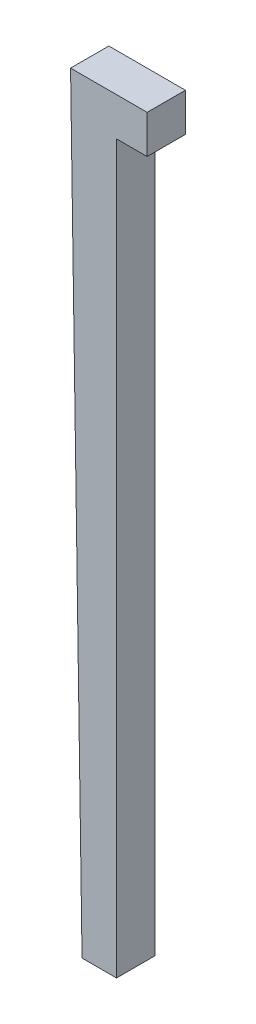
ISO-10303-21;
HEADER;
FILE_DESCRIPTION(('STEP AP214'),'2;1');
FILE_NAME('part.step','',(''),(''),'','','');
FILE_SCHEMA(('AUTOMOTIVE_DESIGN { 1 0 10303 214 1 1 1 1 }'));
ENDSEC;
DATA;
#1=APPLICATION_CONTEXT('core data for automotive mechanical design processes');
#2=APPLICATION_PROTOCOL_DEFINITION('international standard','automotive_design',2000,#1);
#3=PRODUCT_CONTEXT('',#1,'mechanical');
#4=PRODUCT('Part','Part','',(#3));
#5=PRODUCT_RELATED_PRODUCT_CATEGORY('part','',(#4));
#6=PRODUCT_DEFINITION_FORMATION('','',#4);
#7=PRODUCT_DEFINITION_CONTEXT('part definition',#1,'design');
#8=PRODUCT_DEFINITION('design','',#6,#7);
#9=PRODUCT_DEFINITION_SHAPE('','',#8);
#10=(LENGTH_UNIT() NAMED_UNIT(*) SI_UNIT(.MILLI.,.METRE.));
#11=(NAMED_UNIT(*) PLANE_ANGLE_UNIT() SI_UNIT($,.RADIAN.));
#12=(NAMED_UNIT(*) SI_UNIT($,.STERADIAN.) SOLID_ANGLE_UNIT());
#13=UNCERTAINTY_MEASURE_WITH_UNIT(LENGTH_MEASURE(1.E-05),#10,'distance_accuracy_value','');
#14=(GEOMETRIC_REPRESENTATION_CONTEXT(3) GLOBAL_UNCERTAINTY_ASSIGNED_CONTEXT((#13)) GLOBAL_UNIT_ASSIGNED_CONTEXT((#10,
#11,#12)) REPRESENTATION_CONTEXT('',''));
#15=CARTESIAN_POINT('',(0.,0.,0.));
#16=DIRECTION('',(0.,0.,1.));
#17=DIRECTION('',(1.,0.,0.));
#18=AXIS2_PLACEMENT_3D('',#15,#16,#17);
#19=CARTESIAN_POINT('',(9.50876330615437,0.,-2.5));
#20=DIRECTION('',(1.,0.,0.));
#21=DIRECTION('',(0.,0.,1.));
#22=AXIS2_PLACEMENT_3D('',#19,#20,#21);
#23=PLANE('',#22);
#24=CARTESIAN_POINT('',(9.50876330615437,0.,-2.5));
#25=CARTESIAN_POINT('',(9.50876330615436,-33.3,-2.5));
#26=CARTESIAN_POINT('',(9.50876330615435,-66.6,-2.5));
#27=CARTESIAN_POINT('',(9.50876330615434,-99.9,-2.5));
#28=B_SPLINE_CURVE_WITH_KNOTS('',3,(#24,#25,#26,#27),.UNSPECIFIED.,.F.,.F.,(4,4),(0.,1.),.UNSPECIFIED.);
#29=CARTESIAN_POINT('',(9.50876330615434,-5.,-2.5));
#30=VERTEX_POINT('',#29);
#31=CARTESIAN_POINT('',(9.50876330615434,-99.9,-2.5));
#32=VERTEX_POINT('',#31);
#33=EDGE_CURVE('E121',#30,#32,#28,.T.);
#34=ORIENTED_EDGE('',*,*,#33,.F.);
#35=DIRECTION('',(0.,0.,1.));
#36=VECTOR('',#35,1.);
#37=CARTESIAN_POINT('',(9.50876330615434,-5.,-2.5));
#38=LINE('',#37,#36);
#39=CARTESIAN_POINT('',(9.50876330615437,-5.,2.5));
#40=VERTEX_POINT('',#39);
#41=EDGE_CURVE('E282',#30,#40,#38,.T.);
#42=ORIENTED_EDGE('',*,*,#41,.T.);
#43=CARTESIAN_POINT('',(9.50876330615437,0.,2.5));
#44=CARTESIAN_POINT('',(9.50876330615436,-33.3,2.5));
#45=CARTESIAN_POINT('',(9.50876330615435,-66.6,2.5));
#46=CARTESIAN_POINT('',(9.50876330615434,-99.9,2.5));
#47=B_SPLINE_CURVE_WITH_KNOTS('',3,(#43,#44,#45,#46),.UNSPECIFIED.,.F.,.F.,(4,4),(0.,1.),.UNSPECIFIED.);
#48=CARTESIAN_POINT('',(9.50876330615434,-99.9,2.5));
#49=VERTEX_POINT('',#48);
#50=EDGE_CURVE('E267',#40,#49,#47,.T.);
#51=ORIENTED_EDGE('',*,*,#50,.T.);
#52=DIRECTION('',(0.,0.,-1.));
#53=VECTOR('',#52,1.);
#54=CARTESIAN_POINT('',(9.50876330615434,-99.9,2.5));
#55=LINE('',#54,#53);
#56=EDGE_CURVE('E263',#49,#32,#55,.T.);
#57=ORIENTED_EDGE('',*,*,#56,.T.);
#58=EDGE_LOOP('',(#34,#42,#51,#57));
#59=FACE_BOUND('',#58,.T.);
#60=ADVANCED_FACE('F95',(#59),#23,.T.);
#61=CARTESIAN_POINT('',(0.,-99.9,0.));
#62=DIRECTION('',(0.,1.,0.));
#63=DIRECTION('',(0.,0.,1.));
#64=AXIS2_PLACEMENT_3D('',#61,#62,#63);
#65=PLANE('',#64);
#66=ORIENTED_EDGE('',*,*,#56,.F.);
#67=DIRECTION('',(1.,0.,0.));
#68=VECTOR('',#67,1.);
#69=CARTESIAN_POINT('',(9.50876330615434,-99.9,2.5));
#70=LINE('',#69,#68);
#71=CARTESIAN_POINT('',(5.00876330615434,-99.9,2.5));
#72=VERTEX_POINT('',#71);
#73=EDGE_CURVE('E13',#72,#49,#70,.T.);
#74=ORIENTED_EDGE('',*,*,#73,.F.);
#75=DIRECTION('',(0.,0.,1.));
#76=VECTOR('',#75,1.);
#77=CARTESIAN_POINT('',(5.00876330615434,-99.9,2.5));
#78=LINE('',#77,#76);
#79=CARTESIAN_POINT('',(5.00876330615434,-99.9,-2.5));
#80=VERTEX_POINT('',#79);
#81=EDGE_CURVE('E105',#80,#72,#78,.T.);
#82=ORIENTED_EDGE('',*,*,#81,.F.);
#83=DIRECTION('',(-1.,0.,0.));
#84=VECTOR('',#83,1.);
#85=CARTESIAN_POINT('',(9.50876330615434,-99.9,-2.5));
#86=LINE('',#85,#84);
#87=EDGE_CURVE('E369',#32,#80,#86,.T.);
#88=ORIENTED_EDGE('',*,*,#87,.F.);
#89=EDGE_LOOP('',(#66,#74,#82,#88));
#90=FACE_BOUND('',#89,.T.);
#91=ADVANCED_FACE('F199',(#90),#65,.F.);
#92=CARTESIAN_POINT('',(0.,0.,0.));
#93=DIRECTION('',(0.,1.,0.));
#94=DIRECTION('',(0.,0.,1.));
#95=AXIS2_PLACEMENT_3D('',#92,#93,#94);
#96=PLANE('',#95);
#97=DIRECTION('',(0.,0.,1.));
#98=VECTOR('',#97,1.);
#99=CARTESIAN_POINT('',(3.50876330615437,0.,2.5));
#100=LINE('',#99,#98);
#101=CARTESIAN_POINT('',(3.50876330615437,0.,-2.5));
#102=VERTEX_POINT('',#101);
#103=CARTESIAN_POINT('',(3.50876330615437,0.,2.5));
#104=VERTEX_POINT('',#103);
#105=EDGE_CURVE('E177',#102,#104,#100,.T.);
#106=ORIENTED_EDGE('',*,*,#105,.T.);
#107=DIRECTION('',(1.,0.,0.));
#108=VECTOR('',#107,1.);
#109=CARTESIAN_POINT('',(9.50876330615437,0.,2.5));
#110=LINE('',#109,#108);
#111=CARTESIAN_POINT('',(9.50876330615434,0.,2.5));
#112=VERTEX_POINT('',#111);
#113=EDGE_CURVE('E99',#104,#112,#110,.T.);
#114=ORIENTED_EDGE('',*,*,#113,.T.);
#115=DIRECTION('',(-1.,0.,0.));
#116=VECTOR('',#115,1.);
#117=CARTESIAN_POINT('',(9.50876330615434,0.,2.5));
#118=LINE('',#117,#116);
#119=CARTESIAN_POINT('',(13.5087633061544,0.,2.5));
#120=VERTEX_POINT('',#119);
#121=EDGE_CURVE('E387',#120,#112,#118,.T.);
#122=ORIENTED_EDGE('',*,*,#121,.F.);
#123=DIRECTION('',(0.,0.,1.));
#124=VECTOR('',#123,1.);
#125=CARTESIAN_POINT('',(13.5087633061544,0.,-2.5));
#126=LINE('',#125,#124);
#127=CARTESIAN_POINT('',(13.5087633061544,0.,-2.5));
#128=VERTEX_POINT('',#127);
#129=EDGE_CURVE('E166',#128,#120,#126,.T.);
#130=ORIENTED_EDGE('',*,*,#129,.F.);
#131=DIRECTION('',(-1.,0.,0.));
#132=VECTOR('',#131,1.);
#133=CARTESIAN_POINT('',(9.50876330615434,0.,-2.5));
#134=LINE('',#133,#132);
#135=CARTESIAN_POINT('',(9.50876330615434,0.,-2.5));
#136=VERTEX_POINT('',#135);
#137=EDGE_CURVE('E158',#128,#136,#134,.T.);
#138=ORIENTED_EDGE('',*,*,#137,.T.);
#139=DIRECTION('',(-1.,0.,0.));
#140=VECTOR('',#139,1.);
#141=CARTESIAN_POINT('',(9.50876330615437,0.,-2.5));
#142=LINE('',#141,#140);
#143=EDGE_CURVE('E162',#136,#102,#142,.T.);
#144=ORIENTED_EDGE('',*,*,#143,.T.);
#145=EDGE_LOOP('',(#106,#114,#122,#130,#138,#144));
#146=FACE_BOUND('',#145,.T.);
#147=ADVANCED_FACE('F161',(#146),#96,.T.);
#148=CARTESIAN_POINT('',(3.50876330615437,0.,-2.5));
#149=DIRECTION('',(0.,0.,-1.));
#150=DIRECTION('',(1.,0.,0.));
#151=AXIS2_PLACEMENT_3D('',#148,#149,#150);
#152=PLANE('',#151);
#153=ORIENTED_EDGE('',*,*,#143,.F.);
#154=ORIENTED_EDGE('',*,*,#137,.F.);
#155=DIRECTION('',(0.,1.,0.));
#156=VECTOR('',#155,1.);
#157=CARTESIAN_POINT('',(13.5087633061544,0.,-2.5));
#158=LINE('',#157,#156);
#159=CARTESIAN_POINT('',(13.5087633061544,-5.,-2.5));
#160=VERTEX_POINT('',#159);
#161=EDGE_CURVE('E384',#160,#128,#158,.T.);
#162=ORIENTED_EDGE('',*,*,#161,.F.);
#163=DIRECTION('',(1.,0.,0.));
#164=VECTOR('',#163,1.);
#165=CARTESIAN_POINT('',(9.50876330615434,-5.,-2.5));
#166=LINE('',#165,#164);
#167=EDGE_CURVE('E169',#30,#160,#166,.T.);
#168=ORIENTED_EDGE('',*,*,#167,.F.);
#169=ORIENTED_EDGE('',*,*,#33,.T.);
#170=ORIENTED_EDGE('',*,*,#87,.T.);
#171=CARTESIAN_POINT('',(3.50876330615437,0.,-2.5));
#172=CARTESIAN_POINT('',(4.00876330615436,-33.3,-2.5));
#173=CARTESIAN_POINT('',(4.50876330615435,-66.6,-2.5));
#174=CARTESIAN_POINT('',(5.00876330615434,-99.9,-2.5));
#175=B_SPLINE_CURVE_WITH_KNOTS('',3,(#171,#172,#173,#174),.UNSPECIFIED.,.F.,.F.,(4,4),(0.,1.),.UNSPECIFIED.);
#176=EDGE_CURVE('E176',#102,#80,#175,.T.);
#177=ORIENTED_EDGE('',*,*,#176,.F.);
#178=EDGE_LOOP('',(#153,#154,#162,#168,#169,#170,#177));
#179=FACE_BOUND('',#178,.T.);
#180=ADVANCED_FACE('F174',(#179),#152,.T.);
#181=CARTESIAN_POINT('',(3.50876330615437,0.,2.5));
#182=DIRECTION('',(-0.999887293718972,-0.0150133227285128,0.));
#183=DIRECTION('',(0.,0.,-1.));
#184=AXIS2_PLACEMENT_3D('',#181,#182,#183);
#185=PLANE('',#184);
#186=ORIENTED_EDGE('',*,*,#105,.F.);
#187=ORIENTED_EDGE('',*,*,#176,.T.);
#188=ORIENTED_EDGE('',*,*,#81,.T.);
#189=CARTESIAN_POINT('',(3.50876330615437,0.,2.5));
#190=CARTESIAN_POINT('',(4.00876330615436,-33.3,2.5));
#191=CARTESIAN_POINT('',(4.50876330615435,-66.6,2.5));
#192=CARTESIAN_POINT('',(5.00876330615434,-99.9,2.5));
#193=B_SPLINE_CURVE_WITH_KNOTS('',3,(#189,#190,#191,#192),.UNSPECIFIED.,.F.,.F.,(4,4),(0.,1.),.UNSPECIFIED.);
#194=EDGE_CURVE('E275',#104,#72,#193,.T.);
#195=ORIENTED_EDGE('',*,*,#194,.F.);
#196=EDGE_LOOP('',(#186,#187,#188,#195));
#197=FACE_BOUND('',#196,.T.);
#198=ADVANCED_FACE('F198',(#197),#185,.T.);
#199=CARTESIAN_POINT('',(9.50876330615437,0.,2.5));
#200=DIRECTION('',(0.,0.,1.));
#201=DIRECTION('',(-1.,0.,0.));
#202=AXIS2_PLACEMENT_3D('',#199,#200,#201);
#203=PLANE('',#202);
#204=ORIENTED_EDGE('',*,*,#113,.F.);
#205=ORIENTED_EDGE('',*,*,#194,.T.);
#206=ORIENTED_EDGE('',*,*,#73,.T.);
#207=ORIENTED_EDGE('',*,*,#50,.F.);
#208=DIRECTION('',(1.,0.,0.));
#209=VECTOR('',#208,1.);
#210=CARTESIAN_POINT('',(9.50876330615434,-5.,2.5));
#211=LINE('',#210,#209);
#212=CARTESIAN_POINT('',(13.5087633061544,-5.,2.5));
#213=VERTEX_POINT('',#212);
#214=EDGE_CURVE('E113',#40,#213,#211,.T.);
#215=ORIENTED_EDGE('',*,*,#214,.T.);
#216=DIRECTION('',(0.,1.,0.));
#217=VECTOR('',#216,1.);
#218=CARTESIAN_POINT('',(13.5087633061544,0.,2.5));
#219=LINE('',#218,#217);
#220=EDGE_CURVE('E170',#213,#120,#219,.T.);
#221=ORIENTED_EDGE('',*,*,#220,.T.);
#222=ORIENTED_EDGE('',*,*,#121,.T.);
#223=EDGE_LOOP('',(#204,#205,#206,#207,#215,#221,#222));
#224=FACE_BOUND('',#223,.T.);
#225=ADVANCED_FACE('F241',(#224),#203,.T.);
#226=CARTESIAN_POINT('',(13.5087633061544,0.,-2.5));
#227=DIRECTION('',(1.,0.,0.));
#228=DIRECTION('',(0.,1.,0.));
#229=AXIS2_PLACEMENT_3D('',#226,#227,#228);
#230=PLANE('',#229);
#231=ORIENTED_EDGE('',*,*,#220,.F.);
#232=DIRECTION('',(0.,0.,1.));
#233=VECTOR('',#232,1.);
#234=CARTESIAN_POINT('',(13.5087633061544,-5.,-2.5));
#235=LINE('',#234,#233);
#236=EDGE_CURVE('E383',#160,#213,#235,.T.);
#237=ORIENTED_EDGE('',*,*,#236,.F.);
#238=ORIENTED_EDGE('',*,*,#161,.T.);
#239=ORIENTED_EDGE('',*,*,#129,.T.);
#240=EDGE_LOOP('',(#231,#237,#238,#239));
#241=FACE_BOUND('',#240,.T.);
#242=ADVANCED_FACE('F249',(#241),#230,.T.);
#243=CARTESIAN_POINT('',(9.50876330615434,-5.,-2.5));
#244=DIRECTION('',(0.,-1.,0.));
#245=DIRECTION('',(0.,0.,-1.));
#246=AXIS2_PLACEMENT_3D('',#243,#244,#245);
#247=PLANE('',#246);
#248=ORIENTED_EDGE('',*,*,#214,.F.);
#249=ORIENTED_EDGE('',*,*,#41,.F.);
#250=ORIENTED_EDGE('',*,*,#167,.T.);
#251=ORIENTED_EDGE('',*,*,#236,.T.);
#252=EDGE_LOOP('',(#248,#249,#250,#251));
#253=FACE_BOUND('',#252,.T.);
#254=ADVANCED_FACE('F326',(#253),#247,.T.);
#255=CLOSED_SHELL('',(#60,#91,#147,#180,#198,#225,#242,#254));
#256=MANIFOLD_SOLID_BREP('B2',#255);
#257=ADVANCED_BREP_SHAPE_REPRESENTATION('',(#18,#256),#14);
#258=SHAPE_DEFINITION_REPRESENTATION(#9,#257);
ENDSEC;
END-ISO-10303-21;
